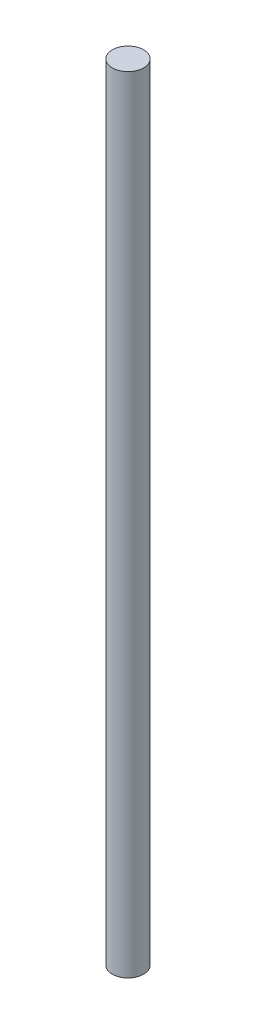
ISO-10303-21;
HEADER;
FILE_DESCRIPTION(('STEP AP214'),'2;1');
FILE_NAME('part.step','',(''),(''),'','','');
FILE_SCHEMA(('AUTOMOTIVE_DESIGN { 1 0 10303 214 1 1 1 1 }'));
ENDSEC;
DATA;
#1=APPLICATION_CONTEXT('core data for automotive mechanical design processes');
#2=APPLICATION_PROTOCOL_DEFINITION('international standard','automotive_design',2000,#1);
#3=PRODUCT_CONTEXT('',#1,'mechanical');
#4=PRODUCT('Part','Part','',(#3));
#5=PRODUCT_RELATED_PRODUCT_CATEGORY('part','',(#4));
#6=PRODUCT_DEFINITION_FORMATION('','',#4);
#7=PRODUCT_DEFINITION_CONTEXT('part definition',#1,'design');
#8=PRODUCT_DEFINITION('design','',#6,#7);
#9=PRODUCT_DEFINITION_SHAPE('','',#8);
#10=(LENGTH_UNIT() NAMED_UNIT(*) SI_UNIT(.MILLI.,.METRE.));
#11=(NAMED_UNIT(*) PLANE_ANGLE_UNIT() SI_UNIT($,.RADIAN.));
#12=(NAMED_UNIT(*) SI_UNIT($,.STERADIAN.) SOLID_ANGLE_UNIT());
#13=UNCERTAINTY_MEASURE_WITH_UNIT(LENGTH_MEASURE(1.E-05),#10,'distance_accuracy_value','');
#14=(GEOMETRIC_REPRESENTATION_CONTEXT(3) GLOBAL_UNCERTAINTY_ASSIGNED_CONTEXT((#13)) GLOBAL_UNIT_ASSIGNED_CONTEXT((#10,
#11,#12)) REPRESENTATION_CONTEXT('',''));
#15=CARTESIAN_POINT('',(0.,0.,0.));
#16=DIRECTION('',(0.,0.,1.));
#17=DIRECTION('',(1.,0.,0.));
#18=AXIS2_PLACEMENT_3D('',#15,#16,#17);
#19=CARTESIAN_POINT('',(0.,100.,0.));
#20=DIRECTION('',(0.,-1.,0.));
#21=DIRECTION('',(0.,0.,-1.));
#22=AXIS2_PLACEMENT_3D('',#19,#20,#21);
#23=CYLINDRICAL_SURFACE('',#22,2.);
#24=CARTESIAN_POINT('',(0.,100.,0.));
#25=DIRECTION('',(0.,1.,0.));
#26=DIRECTION('',(0.,0.,1.));
#27=AXIS2_PLACEMENT_3D('',#24,#25,#26);
#28=CIRCLE('',#27,2.);
#29=CARTESIAN_POINT('',(0.,100.,2.));
#30=VERTEX_POINT('',#29);
#31=EDGE_CURVE('E10',#30,#30,#28,.T.);
#32=ORIENTED_EDGE('',*,*,#31,.F.);
#33=EDGE_LOOP('',(#32));
#34=FACE_BOUND('',#33,.T.);
#35=CARTESIAN_POINT('',(0.,0.,0.));
#36=DIRECTION('',(0.,1.,0.));
#37=DIRECTION('',(0.,0.,1.));
#38=AXIS2_PLACEMENT_3D('',#35,#36,#37);
#39=CIRCLE('',#38,2.);
#40=CARTESIAN_POINT('',(0.,0.,2.));
#41=VERTEX_POINT('',#40);
#42=EDGE_CURVE('E36',#41,#41,#39,.T.);
#43=ORIENTED_EDGE('',*,*,#42,.T.);
#44=EDGE_LOOP('',(#43));
#45=FACE_BOUND('',#44,.T.);
#46=ADVANCED_FACE('F33',(#34,#45),#23,.T.);
#47=CARTESIAN_POINT('',(0.,100.,0.));
#48=DIRECTION('',(0.,1.,0.));
#49=DIRECTION('',(0.,0.,1.));
#50=AXIS2_PLACEMENT_3D('',#47,#48,#49);
#51=PLANE('',#50);
#52=ORIENTED_EDGE('',*,*,#31,.T.);
#53=EDGE_LOOP('',(#52));
#54=FACE_BOUND('',#53,.T.);
#55=ADVANCED_FACE('F48',(#54),#51,.T.);
#56=CARTESIAN_POINT('',(0.,0.,0.));
#57=DIRECTION('',(0.,1.,0.));
#58=DIRECTION('',(0.,0.,1.));
#59=AXIS2_PLACEMENT_3D('',#56,#57,#58);
#60=PLANE('',#59);
#61=ORIENTED_EDGE('',*,*,#42,.F.);
#62=EDGE_LOOP('',(#61));
#63=FACE_BOUND('',#62,.T.);
#64=ADVANCED_FACE('F46',(#63),#60,.F.);
#65=CLOSED_SHELL('',(#46,#55,#64));
#66=MANIFOLD_SOLID_BREP('B2',#65);
#67=ADVANCED_BREP_SHAPE_REPRESENTATION('',(#18,#66),#14);
#68=SHAPE_DEFINITION_REPRESENTATION(#9,#67);
ENDSEC;
END-ISO-10303-21;
